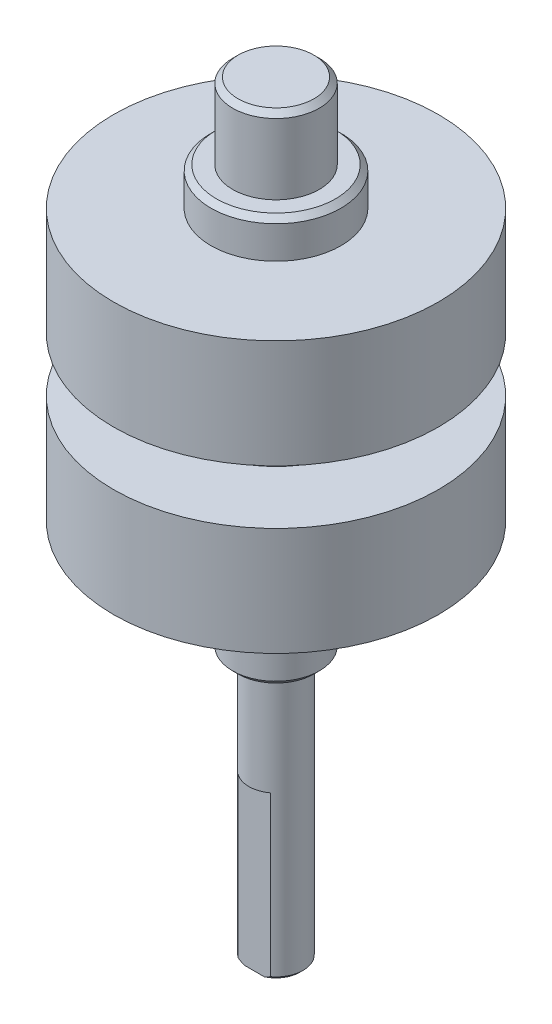
ISO-10303-21;
HEADER;
FILE_DESCRIPTION(('STEP AP214'),'2;1');
FILE_NAME('part.step','',(''),(''),'','','');
FILE_SCHEMA(('AUTOMOTIVE_DESIGN { 1 0 10303 214 1 1 1 1 }'));
ENDSEC;
DATA;
#1=APPLICATION_CONTEXT('core data for automotive mechanical design processes');
#2=APPLICATION_PROTOCOL_DEFINITION('international standard','automotive_design',2000,#1);
#3=PRODUCT_CONTEXT('',#1,'mechanical');
#4=PRODUCT('Part','Part','',(#3));
#5=PRODUCT_RELATED_PRODUCT_CATEGORY('part','',(#4));
#6=PRODUCT_DEFINITION_FORMATION('','',#4);
#7=PRODUCT_DEFINITION_CONTEXT('part definition',#1,'design');
#8=PRODUCT_DEFINITION('design','',#6,#7);
#9=PRODUCT_DEFINITION_SHAPE('','',#8);
#10=(LENGTH_UNIT() NAMED_UNIT(*) SI_UNIT(.MILLI.,.METRE.));
#11=(NAMED_UNIT(*) PLANE_ANGLE_UNIT() SI_UNIT($,.RADIAN.));
#12=(NAMED_UNIT(*) SI_UNIT($,.STERADIAN.) SOLID_ANGLE_UNIT());
#13=UNCERTAINTY_MEASURE_WITH_UNIT(LENGTH_MEASURE(1.E-05),#10,'distance_accuracy_value','');
#14=(GEOMETRIC_REPRESENTATION_CONTEXT(3) GLOBAL_UNCERTAINTY_ASSIGNED_CONTEXT((#13)) GLOBAL_UNIT_ASSIGNED_CONTEXT((#10,
#11,#12)) REPRESENTATION_CONTEXT('',''));
#15=CARTESIAN_POINT('',(0.,0.,0.));
#16=DIRECTION('',(0.,0.,1.));
#17=DIRECTION('',(1.,0.,0.));
#18=AXIS2_PLACEMENT_3D('',#15,#16,#17);
#19=CARTESIAN_POINT('',(0.,46.5,0.));
#20=DIRECTION('',(0.,1.,0.));
#21=DIRECTION('',(0.,0.,-1.));
#22=AXIS2_PLACEMENT_3D('',#19,#20,#21);
#23=PLANE('',#22);
#24=CARTESIAN_POINT('',(0.,46.5,0.));
#25=DIRECTION('',(0.,1.,0.));
#26=DIRECTION('',(0.,0.,1.));
#27=AXIS2_PLACEMENT_3D('',#24,#25,#26);
#28=CIRCLE('',#27,3.5);
#29=CARTESIAN_POINT('',(0.,46.5,3.5));
#30=VERTEX_POINT('',#29);
#31=EDGE_CURVE('E11',#30,#30,#28,.T.);
#32=ORIENTED_EDGE('',*,*,#31,.T.);
#33=EDGE_LOOP('',(#32));
#34=FACE_BOUND('',#33,.T.);
#35=ADVANCED_FACE('F16',(#34),#23,.T.);
#36=CARTESIAN_POINT('',(0.,46.5,0.));
#37=DIRECTION('',(0.,-1.,0.));
#38=DIRECTION('',(0.,0.,1.));
#39=AXIS2_PLACEMENT_3D('',#36,#37,#38);
#40=CONICAL_SURFACE('',#39,3.5,0.785398163397);
#41=DIRECTION('',(0.,-0.707106781186548,0.707106781186548));
#42=VECTOR('',#41,1.);
#43=CARTESIAN_POINT('',(0.,46.5,3.5));
#44=LINE('',#43,#42);
#45=CARTESIAN_POINT('',(0.,46.,4.));
#46=VERTEX_POINT('',#45);
#47=EDGE_CURVE('E29',#30,#46,#44,.T.);
#48=ORIENTED_EDGE('',*,*,#47,.T.);
#49=CARTESIAN_POINT('',(0.,46.,0.));
#50=DIRECTION('',(0.,1.,0.));
#51=DIRECTION('',(0.,0.,1.));
#52=AXIS2_PLACEMENT_3D('',#49,#50,#51);
#53=CIRCLE('',#52,4.);
#54=EDGE_CURVE('E186',#46,#46,#53,.T.);
#55=ORIENTED_EDGE('',*,*,#54,.T.);
#56=ORIENTED_EDGE('',*,*,#47,.F.);
#57=ORIENTED_EDGE('',*,*,#31,.F.);
#58=EDGE_LOOP('',(#48,#55,#56,#57));
#59=FACE_BOUND('',#58,.T.);
#60=ADVANCED_FACE('F340',(#59),#40,.T.);
#61=CARTESIAN_POINT('',(0.,39.5,0.));
#62=DIRECTION('',(0.,1.,0.));
#63=DIRECTION('',(0.,0.,1.));
#64=AXIS2_PLACEMENT_3D('',#61,#62,#63);
#65=CYLINDRICAL_SURFACE('',#64,4.);
#66=CARTESIAN_POINT('',(0.,39.5,0.));
#67=DIRECTION('',(0.,1.,0.));
#68=DIRECTION('',(0.,0.,1.));
#69=AXIS2_PLACEMENT_3D('',#66,#67,#68);
#70=CIRCLE('',#69,4.);
#71=CARTESIAN_POINT('',(0.,39.5,4.));
#72=VERTEX_POINT('',#71);
#73=EDGE_CURVE('E214',#72,#72,#70,.T.);
#74=ORIENTED_EDGE('',*,*,#73,.T.);
#75=DIRECTION('',(0.,1.,0.));
#76=VECTOR('',#75,1.);
#77=CARTESIAN_POINT('',(0.,39.5,4.));
#78=LINE('',#77,#76);
#79=EDGE_CURVE('E211',#72,#46,#78,.T.);
#80=ORIENTED_EDGE('',*,*,#79,.T.);
#81=ORIENTED_EDGE('',*,*,#54,.F.);
#82=ORIENTED_EDGE('',*,*,#79,.F.);
#83=EDGE_LOOP('',(#74,#80,#81,#82));
#84=FACE_BOUND('',#83,.T.);
#85=ADVANCED_FACE('F274',(#84),#65,.T.);
#86=CARTESIAN_POINT('',(0.,39.5,0.));
#87=DIRECTION('',(0.,1.,0.));
#88=DIRECTION('',(0.,0.,-1.));
#89=AXIS2_PLACEMENT_3D('',#86,#87,#88);
#90=PLANE('',#89);
#91=ORIENTED_EDGE('',*,*,#73,.F.);
#92=EDGE_LOOP('',(#91));
#93=FACE_BOUND('',#92,.T.);
#94=CARTESIAN_POINT('',(0.,39.5,0.));
#95=DIRECTION('',(0.,1.,0.));
#96=DIRECTION('',(0.,0.,1.));
#97=AXIS2_PLACEMENT_3D('',#94,#95,#96);
#98=CIRCLE('',#97,5.5);
#99=CARTESIAN_POINT('',(0.,39.5,5.5));
#100=VERTEX_POINT('',#99);
#101=EDGE_CURVE('E216',#100,#100,#98,.T.);
#102=ORIENTED_EDGE('',*,*,#101,.T.);
#103=EDGE_LOOP('',(#102));
#104=FACE_BOUND('',#103,.T.);
#105=ADVANCED_FACE('F277',(#93,#104),#90,.T.);
#106=CARTESIAN_POINT('',(0.,39.,0.));
#107=DIRECTION('',(0.,-1.,0.));
#108=DIRECTION('',(0.,0.,1.));
#109=AXIS2_PLACEMENT_3D('',#106,#107,#108);
#110=CONICAL_SURFACE('',#109,6.,0.785398163397);
#111=CARTESIAN_POINT('',(0.,39.,0.));
#112=DIRECTION('',(0.,1.,0.));
#113=DIRECTION('',(0.,0.,1.));
#114=AXIS2_PLACEMENT_3D('',#111,#112,#113);
#115=CIRCLE('',#114,6.);
#116=CARTESIAN_POINT('',(0.,39.,6.));
#117=VERTEX_POINT('',#116);
#118=EDGE_CURVE('E266',#117,#117,#115,.T.);
#119=ORIENTED_EDGE('',*,*,#118,.T.);
#120=DIRECTION('',(0.,0.707106781186548,-0.707106781186548));
#121=VECTOR('',#120,1.);
#122=CARTESIAN_POINT('',(0.,39.,6.));
#123=LINE('',#122,#121);
#124=EDGE_CURVE('E219',#117,#100,#123,.T.);
#125=ORIENTED_EDGE('',*,*,#124,.T.);
#126=ORIENTED_EDGE('',*,*,#101,.F.);
#127=ORIENTED_EDGE('',*,*,#124,.F.);
#128=EDGE_LOOP('',(#119,#125,#126,#127));
#129=FACE_BOUND('',#128,.T.);
#130=ADVANCED_FACE('F18',(#129),#110,.T.);
#131=CARTESIAN_POINT('',(0.,36.,0.));
#132=DIRECTION('',(0.,1.,0.));
#133=DIRECTION('',(0.,0.,1.));
#134=AXIS2_PLACEMENT_3D('',#131,#132,#133);
#135=CYLINDRICAL_SURFACE('',#134,6.);
#136=CARTESIAN_POINT('',(0.,36.,0.));
#137=DIRECTION('',(0.,1.,0.));
#138=DIRECTION('',(0.,0.,1.));
#139=AXIS2_PLACEMENT_3D('',#136,#137,#138);
#140=CIRCLE('',#139,6.);
#141=CARTESIAN_POINT('',(0.,36.,6.));
#142=VERTEX_POINT('',#141);
#143=EDGE_CURVE('E250',#142,#142,#140,.T.);
#144=ORIENTED_EDGE('',*,*,#143,.T.);
#145=DIRECTION('',(0.,1.,0.));
#146=VECTOR('',#145,1.);
#147=CARTESIAN_POINT('',(0.,36.,6.));
#148=LINE('',#147,#146);
#149=EDGE_CURVE('E257',#142,#117,#148,.T.);
#150=ORIENTED_EDGE('',*,*,#149,.T.);
#151=ORIENTED_EDGE('',*,*,#118,.F.);
#152=ORIENTED_EDGE('',*,*,#149,.F.);
#153=EDGE_LOOP('',(#144,#150,#151,#152));
#154=FACE_BOUND('',#153,.T.);
#155=ADVANCED_FACE('F376',(#154),#135,.T.);
#156=CARTESIAN_POINT('',(0.,36.,0.));
#157=DIRECTION('',(0.,1.,0.));
#158=DIRECTION('',(0.,0.,-1.));
#159=AXIS2_PLACEMENT_3D('',#156,#157,#158);
#160=PLANE('',#159);
#161=ORIENTED_EDGE('',*,*,#143,.F.);
#162=EDGE_LOOP('',(#161));
#163=FACE_BOUND('',#162,.T.);
#164=CARTESIAN_POINT('',(0.,36.,0.));
#165=DIRECTION('',(0.,1.,0.));
#166=DIRECTION('',(0.,0.,1.));
#167=AXIS2_PLACEMENT_3D('',#164,#165,#166);
#168=CIRCLE('',#167,15.);
#169=CARTESIAN_POINT('',(0.,36.,15.));
#170=VERTEX_POINT('',#169);
#171=EDGE_CURVE('E183',#170,#170,#168,.T.);
#172=ORIENTED_EDGE('',*,*,#171,.T.);
#173=EDGE_LOOP('',(#172));
#174=FACE_BOUND('',#173,.T.);
#175=ADVANCED_FACE('F372',(#163,#174),#160,.T.);
#176=CARTESIAN_POINT('',(0.,26.,0.));
#177=DIRECTION('',(0.,1.,0.));
#178=DIRECTION('',(0.,0.,1.));
#179=AXIS2_PLACEMENT_3D('',#176,#177,#178);
#180=CYLINDRICAL_SURFACE('',#179,15.);
#181=CARTESIAN_POINT('',(0.,26.,0.));
#182=DIRECTION('',(0.,1.,0.));
#183=DIRECTION('',(0.,0.,1.));
#184=AXIS2_PLACEMENT_3D('',#181,#182,#183);
#185=CIRCLE('',#184,15.);
#186=CARTESIAN_POINT('',(0.,26.,15.));
#187=VERTEX_POINT('',#186);
#188=EDGE_CURVE('E153',#187,#187,#185,.T.);
#189=ORIENTED_EDGE('',*,*,#188,.T.);
#190=DIRECTION('',(0.,1.,0.));
#191=VECTOR('',#190,1.);
#192=CARTESIAN_POINT('',(0.,26.,15.));
#193=LINE('',#192,#191);
#194=EDGE_CURVE('E160',#187,#170,#193,.T.);
#195=ORIENTED_EDGE('',*,*,#194,.T.);
#196=ORIENTED_EDGE('',*,*,#171,.F.);
#197=ORIENTED_EDGE('',*,*,#194,.F.);
#198=EDGE_LOOP('',(#189,#195,#196,#197));
#199=FACE_BOUND('',#198,.T.);
#200=ADVANCED_FACE('F375',(#199),#180,.T.);
#201=CARTESIAN_POINT('',(0.,26.,0.));
#202=DIRECTION('',(0.,1.,0.));
#203=DIRECTION('',(0.,0.,-1.));
#204=AXIS2_PLACEMENT_3D('',#201,#202,#203);
#205=PLANE('',#204);
#206=CARTESIAN_POINT('',(0.,26.,0.));
#207=DIRECTION('',(0.,1.,0.));
#208=DIRECTION('',(0.,0.,1.));
#209=AXIS2_PLACEMENT_3D('',#206,#207,#208);
#210=CIRCLE('',#209,8.);
#211=CARTESIAN_POINT('',(0.,26.,8.));
#212=VERTEX_POINT('',#211);
#213=EDGE_CURVE('E149',#212,#212,#210,.T.);
#214=ORIENTED_EDGE('',*,*,#213,.T.);
#215=EDGE_LOOP('',(#214));
#216=FACE_BOUND('',#215,.T.);
#217=ORIENTED_EDGE('',*,*,#188,.F.);
#218=EDGE_LOOP('',(#217));
#219=FACE_BOUND('',#218,.T.);
#220=ADVANCED_FACE('F150',(#216,#219),#205,.F.);
#221=CARTESIAN_POINT('',(0.,26.,0.));
#222=DIRECTION('',(0.,-1.,0.));
#223=DIRECTION('',(0.,0.,1.));
#224=AXIS2_PLACEMENT_3D('',#221,#222,#223);
#225=CYLINDRICAL_SURFACE('',#224,8.);
#226=DIRECTION('',(0.,-1.,0.));
#227=VECTOR('',#226,1.);
#228=CARTESIAN_POINT('',(0.,26.,8.));
#229=LINE('',#228,#227);
#230=CARTESIAN_POINT('',(0.,21.,8.));
#231=VERTEX_POINT('',#230);
#232=EDGE_CURVE('E145',#212,#231,#229,.T.);
#233=ORIENTED_EDGE('',*,*,#232,.T.);
#234=CARTESIAN_POINT('',(0.,21.,0.));
#235=DIRECTION('',(0.,1.,0.));
#236=DIRECTION('',(0.,0.,1.));
#237=AXIS2_PLACEMENT_3D('',#234,#235,#236);
#238=CIRCLE('',#237,8.);
#239=EDGE_CURVE('E163',#231,#231,#238,.T.);
#240=ORIENTED_EDGE('',*,*,#239,.T.);
#241=ORIENTED_EDGE('',*,*,#232,.F.);
#242=ORIENTED_EDGE('',*,*,#213,.F.);
#243=EDGE_LOOP('',(#233,#240,#241,#242));
#244=FACE_BOUND('',#243,.T.);
#245=ADVANCED_FACE('F386',(#244),#225,.T.);
#246=CARTESIAN_POINT('',(0.,21.,0.));
#247=DIRECTION('',(0.,-1.,0.));
#248=DIRECTION('',(-1.,0.,0.));
#249=AXIS2_PLACEMENT_3D('',#246,#247,#248);
#250=PLANE('',#249);
#251=CARTESIAN_POINT('',(0.,21.,0.));
#252=DIRECTION('',(0.,1.,0.));
#253=DIRECTION('',(0.,0.,1.));
#254=AXIS2_PLACEMENT_3D('',#251,#252,#253);
#255=CIRCLE('',#254,15.);
#256=CARTESIAN_POINT('',(0.,21.,15.));
#257=VERTEX_POINT('',#256);
#258=EDGE_CURVE('E239',#257,#257,#255,.T.);
#259=ORIENTED_EDGE('',*,*,#258,.T.);
#260=EDGE_LOOP('',(#259));
#261=FACE_BOUND('',#260,.T.);
#262=ORIENTED_EDGE('',*,*,#239,.F.);
#263=EDGE_LOOP('',(#262));
#264=FACE_BOUND('',#263,.T.);
#265=ADVANCED_FACE('F370',(#261,#264),#250,.F.);
#266=CARTESIAN_POINT('',(0.,11.,0.));
#267=DIRECTION('',(0.,1.,0.));
#268=DIRECTION('',(0.,0.,1.));
#269=AXIS2_PLACEMENT_3D('',#266,#267,#268);
#270=CYLINDRICAL_SURFACE('',#269,15.);
#271=CARTESIAN_POINT('',(0.,11.,0.));
#272=DIRECTION('',(0.,1.,0.));
#273=DIRECTION('',(0.,0.,1.));
#274=AXIS2_PLACEMENT_3D('',#271,#272,#273);
#275=CIRCLE('',#274,15.);
#276=CARTESIAN_POINT('',(0.,11.,15.));
#277=VERTEX_POINT('',#276);
#278=EDGE_CURVE('E244',#277,#277,#275,.T.);
#279=ORIENTED_EDGE('',*,*,#278,.T.);
#280=DIRECTION('',(0.,1.,0.));
#281=VECTOR('',#280,1.);
#282=CARTESIAN_POINT('',(0.,11.,15.));
#283=LINE('',#282,#281);
#284=EDGE_CURVE('E167',#277,#257,#283,.T.);
#285=ORIENTED_EDGE('',*,*,#284,.T.);
#286=ORIENTED_EDGE('',*,*,#258,.F.);
#287=ORIENTED_EDGE('',*,*,#284,.F.);
#288=EDGE_LOOP('',(#279,#285,#286,#287));
#289=FACE_BOUND('',#288,.T.);
#290=ADVANCED_FACE('F367',(#289),#270,.T.);
#291=CARTESIAN_POINT('',(0.,11.,0.));
#292=DIRECTION('',(0.,-1.,0.));
#293=DIRECTION('',(-1.,0.,0.));
#294=AXIS2_PLACEMENT_3D('',#291,#292,#293);
#295=PLANE('',#294);
#296=ORIENTED_EDGE('',*,*,#278,.F.);
#297=EDGE_LOOP('',(#296));
#298=FACE_BOUND('',#297,.T.);
#299=CARTESIAN_POINT('',(0.,11.,0.));
#300=DIRECTION('',(0.,1.,0.));
#301=DIRECTION('',(0.,0.,1.));
#302=AXIS2_PLACEMENT_3D('',#299,#300,#301);
#303=CIRCLE('',#302,6.);
#304=CARTESIAN_POINT('',(0.,11.,6.));
#305=VERTEX_POINT('',#304);
#306=EDGE_CURVE('E178',#305,#305,#303,.T.);
#307=ORIENTED_EDGE('',*,*,#306,.T.);
#308=EDGE_LOOP('',(#307));
#309=FACE_BOUND('',#308,.T.);
#310=ADVANCED_FACE('F365',(#298,#309),#295,.T.);
#311=CARTESIAN_POINT('',(0.,8.,0.));
#312=DIRECTION('',(0.,1.,0.));
#313=DIRECTION('',(0.,0.,1.));
#314=AXIS2_PLACEMENT_3D('',#311,#312,#313);
#315=CYLINDRICAL_SURFACE('',#314,6.);
#316=CARTESIAN_POINT('',(0.,8.,0.));
#317=DIRECTION('',(0.,1.,0.));
#318=DIRECTION('',(0.,0.,1.));
#319=AXIS2_PLACEMENT_3D('',#316,#317,#318);
#320=CIRCLE('',#319,6.);
#321=CARTESIAN_POINT('',(0.,8.,6.));
#322=VERTEX_POINT('',#321);
#323=EDGE_CURVE('E179',#322,#322,#320,.T.);
#324=ORIENTED_EDGE('',*,*,#323,.T.);
#325=DIRECTION('',(0.,1.,0.));
#326=VECTOR('',#325,1.);
#327=CARTESIAN_POINT('',(0.,8.,6.));
#328=LINE('',#327,#326);
#329=EDGE_CURVE('E174',#322,#305,#328,.T.);
#330=ORIENTED_EDGE('',*,*,#329,.T.);
#331=ORIENTED_EDGE('',*,*,#306,.F.);
#332=ORIENTED_EDGE('',*,*,#329,.F.);
#333=EDGE_LOOP('',(#324,#330,#331,#332));
#334=FACE_BOUND('',#333,.T.);
#335=ADVANCED_FACE('F362',(#334),#315,.T.);
#336=CARTESIAN_POINT('',(0.,7.5,0.));
#337=DIRECTION('',(0.,1.,0.));
#338=DIRECTION('',(0.,0.,1.));
#339=AXIS2_PLACEMENT_3D('',#336,#337,#338);
#340=CONICAL_SURFACE('',#339,5.5,0.785398163397);
#341=CARTESIAN_POINT('',(0.,7.5,0.));
#342=DIRECTION('',(0.,1.,0.));
#343=DIRECTION('',(0.,0.,1.));
#344=AXIS2_PLACEMENT_3D('',#341,#342,#343);
#345=CIRCLE('',#344,5.5);
#346=CARTESIAN_POINT('',(0.,7.5,5.5));
#347=VERTEX_POINT('',#346);
#348=EDGE_CURVE('E210',#347,#347,#345,.T.);
#349=ORIENTED_EDGE('',*,*,#348,.T.);
#350=DIRECTION('',(0.,0.707106781186548,0.707106781186548));
#351=VECTOR('',#350,1.);
#352=CARTESIAN_POINT('',(0.,7.5,5.5));
#353=LINE('',#352,#351);
#354=EDGE_CURVE('E235',#347,#322,#353,.T.);
#355=ORIENTED_EDGE('',*,*,#354,.T.);
#356=ORIENTED_EDGE('',*,*,#323,.F.);
#357=ORIENTED_EDGE('',*,*,#354,.F.);
#358=EDGE_LOOP('',(#349,#355,#356,#357));
#359=FACE_BOUND('',#358,.T.);
#360=ADVANCED_FACE('F360',(#359),#340,.T.);
#361=CARTESIAN_POINT('',(0.,7.5,0.));
#362=DIRECTION('',(0.,-1.,0.));
#363=DIRECTION('',(-1.,0.,0.));
#364=AXIS2_PLACEMENT_3D('',#361,#362,#363);
#365=PLANE('',#364);
#366=ORIENTED_EDGE('',*,*,#348,.F.);
#367=EDGE_LOOP('',(#366));
#368=FACE_BOUND('',#367,.T.);
#369=CARTESIAN_POINT('',(0.,7.5,0.));
#370=DIRECTION('',(0.,1.,0.));
#371=DIRECTION('',(0.,0.,1.));
#372=AXIS2_PLACEMENT_3D('',#369,#370,#371);
#373=CIRCLE('',#372,4.);
#374=CARTESIAN_POINT('',(0.,7.5,4.));
#375=VERTEX_POINT('',#374);
#376=EDGE_CURVE('E207',#375,#375,#373,.T.);
#377=ORIENTED_EDGE('',*,*,#376,.T.);
#378=EDGE_LOOP('',(#377));
#379=FACE_BOUND('',#378,.T.);
#380=ADVANCED_FACE('F356',(#368,#379),#365,.T.);
#381=CARTESIAN_POINT('',(0.,1.,0.));
#382=DIRECTION('',(0.,1.,0.));
#383=DIRECTION('',(0.,0.,1.));
#384=AXIS2_PLACEMENT_3D('',#381,#382,#383);
#385=CYLINDRICAL_SURFACE('',#384,4.);
#386=CARTESIAN_POINT('',(0.,1.,0.));
#387=DIRECTION('',(0.,1.,0.));
#388=DIRECTION('',(0.,0.,1.));
#389=AXIS2_PLACEMENT_3D('',#386,#387,#388);
#390=CIRCLE('',#389,4.);
#391=CARTESIAN_POINT('',(0.,1.,4.));
#392=VERTEX_POINT('',#391);
#393=EDGE_CURVE('E172',#392,#392,#390,.T.);
#394=ORIENTED_EDGE('',*,*,#393,.T.);
#395=DIRECTION('',(0.,1.,0.));
#396=VECTOR('',#395,1.);
#397=CARTESIAN_POINT('',(0.,1.,4.));
#398=LINE('',#397,#396);
#399=EDGE_CURVE('E203',#392,#375,#398,.T.);
#400=ORIENTED_EDGE('',*,*,#399,.T.);
#401=ORIENTED_EDGE('',*,*,#376,.F.);
#402=ORIENTED_EDGE('',*,*,#399,.F.);
#403=EDGE_LOOP('',(#394,#400,#401,#402));
#404=FACE_BOUND('',#403,.T.);
#405=ADVANCED_FACE('F353',(#404),#385,.T.);
#406=CARTESIAN_POINT('',(0.,0.5,0.));
#407=DIRECTION('',(0.,1.,0.));
#408=DIRECTION('',(0.,0.,1.));
#409=AXIS2_PLACEMENT_3D('',#406,#407,#408);
#410=CONICAL_SURFACE('',#409,3.5,0.785398163397);
#411=CARTESIAN_POINT('',(0.,0.5,0.));
#412=DIRECTION('',(0.,1.,0.));
#413=DIRECTION('',(0.,0.,1.));
#414=AXIS2_PLACEMENT_3D('',#411,#412,#413);
#415=CIRCLE('',#414,3.5);
#416=CARTESIAN_POINT('',(0.,0.5,3.5));
#417=VERTEX_POINT('',#416);
#418=EDGE_CURVE('E173',#417,#417,#415,.T.);
#419=ORIENTED_EDGE('',*,*,#418,.T.);
#420=DIRECTION('',(0.,0.707106781186548,0.707106781186548));
#421=VECTOR('',#420,1.);
#422=CARTESIAN_POINT('',(0.,0.5,3.5));
#423=LINE('',#422,#421);
#424=EDGE_CURVE('E169',#417,#392,#423,.T.);
#425=ORIENTED_EDGE('',*,*,#424,.T.);
#426=ORIENTED_EDGE('',*,*,#393,.F.);
#427=ORIENTED_EDGE('',*,*,#424,.F.);
#428=EDGE_LOOP('',(#419,#425,#426,#427));
#429=FACE_BOUND('',#428,.T.);
#430=ADVANCED_FACE('F334',(#429),#410,.T.);
#431=CARTESIAN_POINT('',(0.,0.5,0.));
#432=DIRECTION('',(0.,-1.,0.));
#433=DIRECTION('',(-1.,0.,0.));
#434=AXIS2_PLACEMENT_3D('',#431,#432,#433);
#435=PLANE('',#434);
#436=ORIENTED_EDGE('',*,*,#418,.F.);
#437=EDGE_LOOP('',(#436));
#438=FACE_BOUND('',#437,.T.);
#439=CARTESIAN_POINT('',(0.,0.5,0.));
#440=DIRECTION('',(0.,1.,0.));
#441=DIRECTION('',(0.,0.,1.));
#442=AXIS2_PLACEMENT_3D('',#439,#440,#441);
#443=CIRCLE('',#442,2.5);
#444=CARTESIAN_POINT('',(0.,0.5,2.5));
#445=VERTEX_POINT('',#444);
#446=EDGE_CURVE('E197',#445,#445,#443,.T.);
#447=ORIENTED_EDGE('',*,*,#446,.T.);
#448=EDGE_LOOP('',(#447));
#449=FACE_BOUND('',#448,.T.);
#450=ADVANCED_FACE('F326',(#438,#449),#435,.T.);
#451=CARTESIAN_POINT('',(0.,-9.,2.25));
#452=DIRECTION('',(0.,1.,0.));
#453=DIRECTION('',(0.,0.,-1.));
#454=AXIS2_PLACEMENT_3D('',#451,#452,#453);
#455=PLANE('',#454);
#456=CARTESIAN_POINT('',(0.,-9.,0.));
#457=DIRECTION('',(0.,1.,0.));
#458=DIRECTION('',(0.,0.,1.));
#459=AXIS2_PLACEMENT_3D('',#456,#457,#458);
#460=CIRCLE('',#459,2.5);
#461=CARTESIAN_POINT('',(0.,-9.,2.5));
#462=VERTEX_POINT('',#461);
#463=CARTESIAN_POINT('',(1.5,-9.,2.));
#464=VERTEX_POINT('',#463);
#465=EDGE_CURVE('E122',#462,#464,#460,.T.);
#466=ORIENTED_EDGE('',*,*,#465,.F.);
#467=CARTESIAN_POINT('',(0.,-9.,0.));
#468=DIRECTION('',(0.,1.,0.));
#469=DIRECTION('',(0.,0.,1.));
#470=AXIS2_PLACEMENT_3D('',#467,#468,#469);
#471=CIRCLE('',#470,2.5);
#472=CARTESIAN_POINT('',(-1.5,-9.,2.));
#473=VERTEX_POINT('',#472);
#474=EDGE_CURVE('E198',#473,#462,#471,.T.);
#475=ORIENTED_EDGE('',*,*,#474,.F.);
#476=DIRECTION('',(-1.,0.,0.));
#477=VECTOR('',#476,1.);
#478=CARTESIAN_POINT('',(2.,-9.,2.));
#479=LINE('',#478,#477);
#480=EDGE_CURVE('E202',#464,#473,#479,.T.);
#481=ORIENTED_EDGE('',*,*,#480,.F.);
#482=EDGE_LOOP('',(#466,#475,#481));
#483=FACE_BOUND('',#482,.T.);
#484=ADVANCED_FACE('F324',(#483),#455,.F.);
#485=CARTESIAN_POINT('',(0.,-23.7,0.));
#486=DIRECTION('',(0.,1.,0.));
#487=DIRECTION('',(0.,0.,1.));
#488=AXIS2_PLACEMENT_3D('',#485,#486,#487);
#489=CYLINDRICAL_SURFACE('',#488,2.5);
#490=DIRECTION('',(0.,1.,0.));
#491=VECTOR('',#490,1.);
#492=CARTESIAN_POINT('',(1.5,-23.7,2.));
#493=LINE('',#492,#491);
#494=CARTESIAN_POINT('',(1.5,-23.7,2.));
#495=VERTEX_POINT('',#494);
#496=EDGE_CURVE('E191',#495,#464,#493,.T.);
#497=ORIENTED_EDGE('',*,*,#496,.F.);
#498=CARTESIAN_POINT('',(0.,-23.7,0.));
#499=DIRECTION('',(0.,1.,0.));
#500=DIRECTION('',(0.,0.,1.));
#501=AXIS2_PLACEMENT_3D('',#498,#499,#500);
#502=CIRCLE('',#501,2.5);
#503=CARTESIAN_POINT('',(-1.5,-23.7,2.));
#504=VERTEX_POINT('',#503);
#505=EDGE_CURVE('E192',#495,#504,#502,.T.);
#506=ORIENTED_EDGE('',*,*,#505,.T.);
#507=DIRECTION('',(0.,1.,0.));
#508=VECTOR('',#507,1.);
#509=CARTESIAN_POINT('',(-1.5,-23.7,2.));
#510=LINE('',#509,#508);
#511=EDGE_CURVE('E187',#504,#473,#510,.T.);
#512=ORIENTED_EDGE('',*,*,#511,.T.);
#513=ORIENTED_EDGE('',*,*,#474,.T.);
#514=DIRECTION('',(0.,1.,0.));
#515=VECTOR('',#514,1.);
#516=CARTESIAN_POINT('',(0.,-23.7,2.5));
#517=LINE('',#516,#515);
#518=EDGE_CURVE('E193',#462,#445,#517,.T.);
#519=ORIENTED_EDGE('',*,*,#518,.T.);
#520=ORIENTED_EDGE('',*,*,#446,.F.);
#521=ORIENTED_EDGE('',*,*,#518,.F.);
#522=ORIENTED_EDGE('',*,*,#465,.T.);
#523=EDGE_LOOP('',(#497,#506,#512,#513,#519,#520,#521,#522));
#524=FACE_BOUND('',#523,.T.);
#525=ADVANCED_FACE('F323',(#524),#489,.T.);
#526=CARTESIAN_POINT('',(2.,-9.,2.));
#527=DIRECTION('',(0.,0.,-1.));
#528=DIRECTION('',(0.,-1.,0.));
#529=AXIS2_PLACEMENT_3D('',#526,#527,#528);
#530=PLANE('',#529);
#531=ORIENTED_EDGE('',*,*,#511,.F.);
#532=CARTESIAN_POINT('',(-1.5,-23.7,2.));
#533=CARTESIAN_POINT('',(-1.18963571222917,-23.8862185726625,2.));
#534=CARTESIAN_POINT('',(-0.916515138990876,-24.,2.));
#535=(BOUNDED_CURVE() B_SPLINE_CURVE(2,(#532,#533,#534),.UNSPECIFIED.,.F.,
.F.) B_SPLINE_CURVE_WITH_KNOTS((3,3),(0.,1.),
.UNSPECIFIED.) CURVE() GEOMETRIC_REPRESENTATION_ITEM() RATIONAL_B_SPLINE_CURVE((1.,
1.00779631445989,1.)) REPRESENTATION_ITEM(''));
#536=CARTESIAN_POINT('',(-0.916515138991,-24.,2.));
#537=VERTEX_POINT('',#536);
#538=EDGE_CURVE('E226',#504,#537,#535,.T.);
#539=ORIENTED_EDGE('',*,*,#538,.T.);
#540=DIRECTION('',(1.,0.,0.));
#541=VECTOR('',#540,1.);
#542=CARTESIAN_POINT('',(1.,-24.,2.));
#543=LINE('',#542,#541);
#544=CARTESIAN_POINT('',(0.916515138991,-24.,2.));
#545=VERTEX_POINT('',#544);
#546=EDGE_CURVE('E227',#537,#545,#543,.T.);
#547=ORIENTED_EDGE('',*,*,#546,.T.);
#548=CARTESIAN_POINT('',(0.916515138991047,-24.,2.));
#549=CARTESIAN_POINT('',(1.18963571222927,-23.8862185726625,2.));
#550=CARTESIAN_POINT('',(1.5,-23.7,2.));
#551=(BOUNDED_CURVE() B_SPLINE_CURVE(2,(#548,#549,#550),.UNSPECIFIED.,.F.,
.F.) B_SPLINE_CURVE_WITH_KNOTS((3,3),(0.,1.),
.UNSPECIFIED.) CURVE() GEOMETRIC_REPRESENTATION_ITEM() RATIONAL_B_SPLINE_CURVE((1.,
1.00779631446006,1.)) REPRESENTATION_ITEM(''));
#552=EDGE_CURVE('E20',#545,#495,#551,.T.);
#553=ORIENTED_EDGE('',*,*,#552,.T.);
#554=ORIENTED_EDGE('',*,*,#496,.T.);
#555=ORIENTED_EDGE('',*,*,#480,.T.);
#556=EDGE_LOOP('',(#531,#539,#547,#553,#554,#555));
#557=FACE_BOUND('',#556,.T.);
#558=ADVANCED_FACE('F317',(#557),#530,.F.);
#559=CARTESIAN_POINT('',(0.,-24.,0.));
#560=DIRECTION('',(0.,1.,0.));
#561=DIRECTION('',(0.,0.,1.));
#562=AXIS2_PLACEMENT_3D('',#559,#560,#561);
#563=CONICAL_SURFACE('',#562,2.2,0.785398163397);
#564=ORIENTED_EDGE('',*,*,#552,.F.);
#565=CARTESIAN_POINT('',(0.,-24.,0.));
#566=DIRECTION('',(0.,1.,0.));
#567=DIRECTION('',(0.,0.,1.));
#568=AXIS2_PLACEMENT_3D('',#565,#566,#567);
#569=CIRCLE('',#568,2.2);
#570=EDGE_CURVE('E231',#545,#537,#569,.T.);
#571=ORIENTED_EDGE('',*,*,#570,.T.);
#572=ORIENTED_EDGE('',*,*,#538,.F.);
#573=ORIENTED_EDGE('',*,*,#505,.F.);
#574=EDGE_LOOP('',(#564,#571,#572,#573));
#575=FACE_BOUND('',#574,.T.);
#576=ADVANCED_FACE('F322',(#575),#563,.T.);
#577=CARTESIAN_POINT('',(0.,-24.,0.));
#578=DIRECTION('',(0.,-1.,0.));
#579=DIRECTION('',(-1.,0.,0.));
#580=AXIS2_PLACEMENT_3D('',#577,#578,#579);
#581=PLANE('',#580);
#582=ORIENTED_EDGE('',*,*,#570,.F.);
#583=ORIENTED_EDGE('',*,*,#546,.F.);
#584=EDGE_LOOP('',(#582,#583));
#585=FACE_BOUND('',#584,.T.);
#586=ADVANCED_FACE('F347',(#585),#581,.T.);
#587=CLOSED_SHELL('',(#35,#60,#85,#105,#130,#155,#175,#200,#220,#245,#265,#290,#310,#335,#360,
#380,#405,#430,#450,#484,#525,#558,#576,#586));
#588=MANIFOLD_SOLID_BREP('B1',#587);
#589=ADVANCED_BREP_SHAPE_REPRESENTATION('',(#18,#588),#14);
#590=SHAPE_DEFINITION_REPRESENTATION(#9,#589);
ENDSEC;
END-ISO-10303-21;
